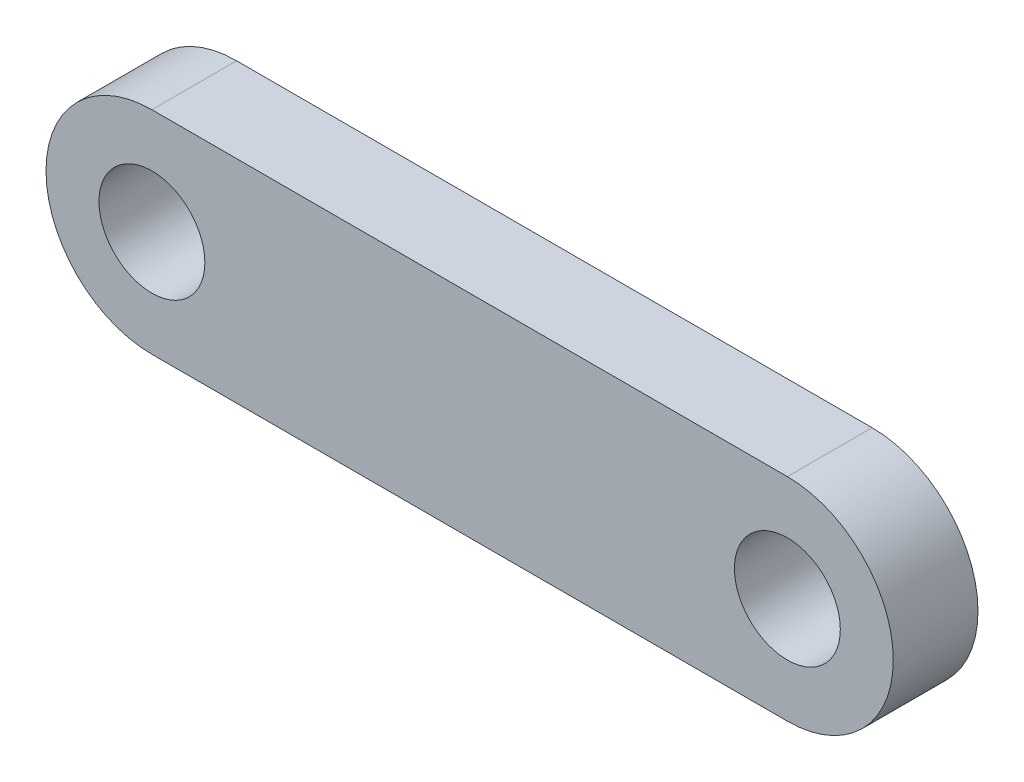
ISO-10303-21;
HEADER;
FILE_DESCRIPTION(('STEP AP214'),'2;1');
FILE_NAME('part.step','',(''),(''),'','','');
FILE_SCHEMA(('AUTOMOTIVE_DESIGN { 1 0 10303 214 1 1 1 1 }'));
ENDSEC;
DATA;
#1=APPLICATION_CONTEXT('core data for automotive mechanical design processes');
#2=APPLICATION_PROTOCOL_DEFINITION('international standard','automotive_design',2000,#1);
#3=PRODUCT_CONTEXT('',#1,'mechanical');
#4=PRODUCT('Part','Part','',(#3));
#5=PRODUCT_RELATED_PRODUCT_CATEGORY('part','',(#4));
#6=PRODUCT_DEFINITION_FORMATION('','',#4);
#7=PRODUCT_DEFINITION_CONTEXT('part definition',#1,'design');
#8=PRODUCT_DEFINITION('design','',#6,#7);
#9=PRODUCT_DEFINITION_SHAPE('','',#8);
#10=(LENGTH_UNIT() NAMED_UNIT(*) SI_UNIT(.MILLI.,.METRE.));
#11=(NAMED_UNIT(*) PLANE_ANGLE_UNIT() SI_UNIT($,.RADIAN.));
#12=(NAMED_UNIT(*) SI_UNIT($,.STERADIAN.) SOLID_ANGLE_UNIT());
#13=UNCERTAINTY_MEASURE_WITH_UNIT(LENGTH_MEASURE(1.E-05),#10,'distance_accuracy_value','');
#14=(GEOMETRIC_REPRESENTATION_CONTEXT(3) GLOBAL_UNCERTAINTY_ASSIGNED_CONTEXT((#13)) GLOBAL_UNIT_ASSIGNED_CONTEXT((#10,
#11,#12)) REPRESENTATION_CONTEXT('',''));
#15=CARTESIAN_POINT('',(0.,0.,0.));
#16=DIRECTION('',(0.,0.,1.));
#17=DIRECTION('',(1.,0.,0.));
#18=AXIS2_PLACEMENT_3D('',#15,#16,#17);
#19=CARTESIAN_POINT('',(0.,0.,4.));
#20=DIRECTION('',(0.,0.,1.));
#21=DIRECTION('',(1.,0.,0.));
#22=AXIS2_PLACEMENT_3D('',#19,#20,#21);
#23=PLANE('',#22);
#24=CARTESIAN_POINT('',(30.,0.,4.));
#25=DIRECTION('',(0.,0.,1.));
#26=DIRECTION('',(1.,0.,0.));
#27=AXIS2_PLACEMENT_3D('',#24,#25,#26);
#28=CIRCLE('',#27,2.5);
#29=CARTESIAN_POINT('',(32.5,0.,4.));
#30=VERTEX_POINT('',#29);
#31=EDGE_CURVE('E100',#30,#30,#28,.T.);
#32=ORIENTED_EDGE('',*,*,#31,.F.);
#33=EDGE_LOOP('',(#32));
#34=FACE_BOUND('',#33,.T.);
#35=CARTESIAN_POINT('',(0.,0.,4.));
#36=DIRECTION('',(0.,0.,1.));
#37=DIRECTION('',(1.,0.,0.));
#38=AXIS2_PLACEMENT_3D('',#35,#36,#37);
#39=CIRCLE('',#38,5.);
#40=CARTESIAN_POINT('',(0.,5.,4.));
#41=VERTEX_POINT('',#40);
#42=CARTESIAN_POINT('',(0.,-5.,4.));
#43=VERTEX_POINT('',#42);
#44=EDGE_CURVE('E85',#41,#43,#39,.T.);
#45=ORIENTED_EDGE('',*,*,#44,.T.);
#46=DIRECTION('',(1.,0.,0.));
#47=VECTOR('',#46,1.);
#48=CARTESIAN_POINT('',(0.,-5.,4.));
#49=LINE('',#48,#47);
#50=CARTESIAN_POINT('',(30.,-5.,4.));
#51=VERTEX_POINT('',#50);
#52=EDGE_CURVE('E80',#43,#51,#49,.T.);
#53=ORIENTED_EDGE('',*,*,#52,.T.);
#54=CARTESIAN_POINT('',(30.,0.,4.));
#55=DIRECTION('',(0.,0.,1.));
#56=DIRECTION('',(1.,0.,0.));
#57=AXIS2_PLACEMENT_3D('',#54,#55,#56);
#58=CIRCLE('',#57,5.);
#59=CARTESIAN_POINT('',(30.,5.,4.));
#60=VERTEX_POINT('',#59);
#61=EDGE_CURVE('E83',#51,#60,#58,.T.);
#62=ORIENTED_EDGE('',*,*,#61,.T.);
#63=DIRECTION('',(-1.,0.,0.));
#64=VECTOR('',#63,1.);
#65=CARTESIAN_POINT('',(0.,5.,4.));
#66=LINE('',#65,#64);
#67=EDGE_CURVE('E50',#60,#41,#66,.T.);
#68=ORIENTED_EDGE('',*,*,#67,.T.);
#69=EDGE_LOOP('',(#45,#53,#62,#68));
#70=FACE_BOUND('',#69,.T.);
#71=CARTESIAN_POINT('',(0.,0.,4.));
#72=DIRECTION('',(0.,0.,1.));
#73=DIRECTION('',(1.,0.,0.));
#74=AXIS2_PLACEMENT_3D('',#71,#72,#73);
#75=CIRCLE('',#74,2.5);
#76=CARTESIAN_POINT('',(2.5,0.,4.));
#77=VERTEX_POINT('',#76);
#78=EDGE_CURVE('E115',#77,#77,#75,.T.);
#79=ORIENTED_EDGE('',*,*,#78,.F.);
#80=EDGE_LOOP('',(#79));
#81=FACE_BOUND('',#80,.T.);
#82=ADVANCED_FACE('F33',(#34,#70,#81),#23,.T.);
#83=CARTESIAN_POINT('',(0.,0.,0.));
#84=DIRECTION('',(0.,0.,1.));
#85=DIRECTION('',(1.,0.,0.));
#86=AXIS2_PLACEMENT_3D('',#83,#84,#85);
#87=PLANE('',#86);
#88=CARTESIAN_POINT('',(0.,0.,0.));
#89=DIRECTION('',(0.,0.,1.));
#90=DIRECTION('',(1.,0.,0.));
#91=AXIS2_PLACEMENT_3D('',#88,#89,#90);
#92=CIRCLE('',#91,5.);
#93=CARTESIAN_POINT('',(0.,5.,0.));
#94=VERTEX_POINT('',#93);
#95=CARTESIAN_POINT('',(0.,-5.,0.));
#96=VERTEX_POINT('',#95);
#97=EDGE_CURVE('E97',#94,#96,#92,.T.);
#98=ORIENTED_EDGE('',*,*,#97,.F.);
#99=DIRECTION('',(-1.,0.,0.));
#100=VECTOR('',#99,1.);
#101=CARTESIAN_POINT('',(0.,5.,0.));
#102=LINE('',#101,#100);
#103=CARTESIAN_POINT('',(30.,5.,0.));
#104=VERTEX_POINT('',#103);
#105=EDGE_CURVE('E73',#104,#94,#102,.T.);
#106=ORIENTED_EDGE('',*,*,#105,.F.);
#107=CARTESIAN_POINT('',(30.,0.,0.));
#108=DIRECTION('',(0.,0.,1.));
#109=DIRECTION('',(1.,0.,0.));
#110=AXIS2_PLACEMENT_3D('',#107,#108,#109);
#111=CIRCLE('',#110,5.);
#112=CARTESIAN_POINT('',(30.,-5.,0.));
#113=VERTEX_POINT('',#112);
#114=EDGE_CURVE('E67',#113,#104,#111,.T.);
#115=ORIENTED_EDGE('',*,*,#114,.F.);
#116=DIRECTION('',(1.,0.,0.));
#117=VECTOR('',#116,1.);
#118=CARTESIAN_POINT('',(0.,-5.,0.));
#119=LINE('',#118,#117);
#120=EDGE_CURVE('E89',#96,#113,#119,.T.);
#121=ORIENTED_EDGE('',*,*,#120,.F.);
#122=EDGE_LOOP('',(#98,#106,#115,#121));
#123=FACE_BOUND('',#122,.T.);
#124=CARTESIAN_POINT('',(30.,0.,0.));
#125=DIRECTION('',(0.,0.,1.));
#126=DIRECTION('',(1.,0.,0.));
#127=AXIS2_PLACEMENT_3D('',#124,#125,#126);
#128=CIRCLE('',#127,2.5);
#129=CARTESIAN_POINT('',(32.5,0.,0.));
#130=VERTEX_POINT('',#129);
#131=EDGE_CURVE('E112',#130,#130,#128,.T.);
#132=ORIENTED_EDGE('',*,*,#131,.T.);
#133=EDGE_LOOP('',(#132));
#134=FACE_BOUND('',#133,.T.);
#135=CARTESIAN_POINT('',(0.,0.,0.));
#136=DIRECTION('',(0.,0.,1.));
#137=DIRECTION('',(1.,0.,0.));
#138=AXIS2_PLACEMENT_3D('',#135,#136,#137);
#139=CIRCLE('',#138,2.5);
#140=CARTESIAN_POINT('',(2.5,0.,0.));
#141=VERTEX_POINT('',#140);
#142=EDGE_CURVE('E118',#141,#141,#139,.T.);
#143=ORIENTED_EDGE('',*,*,#142,.T.);
#144=EDGE_LOOP('',(#143));
#145=FACE_BOUND('',#144,.T.);
#146=ADVANCED_FACE('F108',(#123,#134,#145),#87,.F.);
#147=CARTESIAN_POINT('',(0.,0.,4.));
#148=DIRECTION('',(0.,0.,-1.));
#149=DIRECTION('',(-1.,0.,0.));
#150=AXIS2_PLACEMENT_3D('',#147,#148,#149);
#151=CYLINDRICAL_SURFACE('',#150,5.);
#152=ORIENTED_EDGE('',*,*,#97,.T.);
#153=DIRECTION('',(0.,0.,-1.));
#154=VECTOR('',#153,1.);
#155=CARTESIAN_POINT('',(0.,-5.,4.));
#156=LINE('',#155,#154);
#157=EDGE_CURVE('E11',#43,#96,#156,.T.);
#158=ORIENTED_EDGE('',*,*,#157,.F.);
#159=ORIENTED_EDGE('',*,*,#44,.F.);
#160=DIRECTION('',(0.,0.,-1.));
#161=VECTOR('',#160,1.);
#162=CARTESIAN_POINT('',(0.,5.,4.));
#163=LINE('',#162,#161);
#164=EDGE_CURVE('E93',#41,#94,#163,.T.);
#165=ORIENTED_EDGE('',*,*,#164,.T.);
#166=EDGE_LOOP('',(#152,#158,#159,#165));
#167=FACE_BOUND('',#166,.T.);
#168=ADVANCED_FACE('F35',(#167),#151,.T.);
#169=CARTESIAN_POINT('',(0.,-5.,4.));
#170=DIRECTION('',(0.,1.,0.));
#171=DIRECTION('',(0.,0.,1.));
#172=AXIS2_PLACEMENT_3D('',#169,#170,#171);
#173=PLANE('',#172);
#174=ORIENTED_EDGE('',*,*,#120,.T.);
#175=DIRECTION('',(0.,0.,-1.));
#176=VECTOR('',#175,1.);
#177=CARTESIAN_POINT('',(30.,-5.,4.));
#178=LINE('',#177,#176);
#179=EDGE_CURVE('E42',#51,#113,#178,.T.);
#180=ORIENTED_EDGE('',*,*,#179,.F.);
#181=ORIENTED_EDGE('',*,*,#52,.F.);
#182=ORIENTED_EDGE('',*,*,#157,.T.);
#183=EDGE_LOOP('',(#174,#180,#181,#182));
#184=FACE_BOUND('',#183,.T.);
#185=ADVANCED_FACE('F88',(#184),#173,.F.);
#186=CARTESIAN_POINT('',(30.,0.,4.));
#187=DIRECTION('',(0.,0.,-1.));
#188=DIRECTION('',(-1.,0.,0.));
#189=AXIS2_PLACEMENT_3D('',#186,#187,#188);
#190=CYLINDRICAL_SURFACE('',#189,5.);
#191=ORIENTED_EDGE('',*,*,#114,.T.);
#192=DIRECTION('',(0.,0.,-1.));
#193=VECTOR('',#192,1.);
#194=CARTESIAN_POINT('',(30.,5.,4.));
#195=LINE('',#194,#193);
#196=EDGE_CURVE('E90',#60,#104,#195,.T.);
#197=ORIENTED_EDGE('',*,*,#196,.F.);
#198=ORIENTED_EDGE('',*,*,#61,.F.);
#199=ORIENTED_EDGE('',*,*,#179,.T.);
#200=EDGE_LOOP('',(#191,#197,#198,#199));
#201=FACE_BOUND('',#200,.T.);
#202=ADVANCED_FACE('F91',(#201),#190,.T.);
#203=CARTESIAN_POINT('',(0.,5.,4.));
#204=DIRECTION('',(0.,-1.,0.));
#205=DIRECTION('',(0.,0.,-1.));
#206=AXIS2_PLACEMENT_3D('',#203,#204,#205);
#207=PLANE('',#206);
#208=ORIENTED_EDGE('',*,*,#105,.T.);
#209=ORIENTED_EDGE('',*,*,#164,.F.);
#210=ORIENTED_EDGE('',*,*,#67,.F.);
#211=ORIENTED_EDGE('',*,*,#196,.T.);
#212=EDGE_LOOP('',(#208,#209,#210,#211));
#213=FACE_BOUND('',#212,.T.);
#214=ADVANCED_FACE('F105',(#213),#207,.F.);
#215=CARTESIAN_POINT('',(30.,0.,4.));
#216=DIRECTION('',(0.,0.,-1.));
#217=DIRECTION('',(-1.,0.,0.));
#218=AXIS2_PLACEMENT_3D('',#215,#216,#217);
#219=CYLINDRICAL_SURFACE('',#218,2.5);
#220=ORIENTED_EDGE('',*,*,#31,.T.);
#221=EDGE_LOOP('',(#220));
#222=FACE_BOUND('',#221,.T.);
#223=ORIENTED_EDGE('',*,*,#131,.F.);
#224=EDGE_LOOP('',(#223));
#225=FACE_BOUND('',#224,.T.);
#226=ADVANCED_FACE('F135',(#222,#225),#219,.F.);
#227=CARTESIAN_POINT('',(0.,0.,4.));
#228=DIRECTION('',(0.,0.,-1.));
#229=DIRECTION('',(-1.,0.,0.));
#230=AXIS2_PLACEMENT_3D('',#227,#228,#229);
#231=CYLINDRICAL_SURFACE('',#230,2.5);
#232=ORIENTED_EDGE('',*,*,#78,.T.);
#233=EDGE_LOOP('',(#232));
#234=FACE_BOUND('',#233,.T.);
#235=ORIENTED_EDGE('',*,*,#142,.F.);
#236=EDGE_LOOP('',(#235));
#237=FACE_BOUND('',#236,.T.);
#238=ADVANCED_FACE('F124',(#234,#237),#231,.F.);
#239=CLOSED_SHELL('',(#82,#146,#168,#185,#202,#214,#226,#238));
#240=MANIFOLD_SOLID_BREP('B2',#239);
#241=ADVANCED_BREP_SHAPE_REPRESENTATION('',(#18,#240),#14);
#242=SHAPE_DEFINITION_REPRESENTATION(#9,#241);
ENDSEC;
END-ISO-10303-21;
